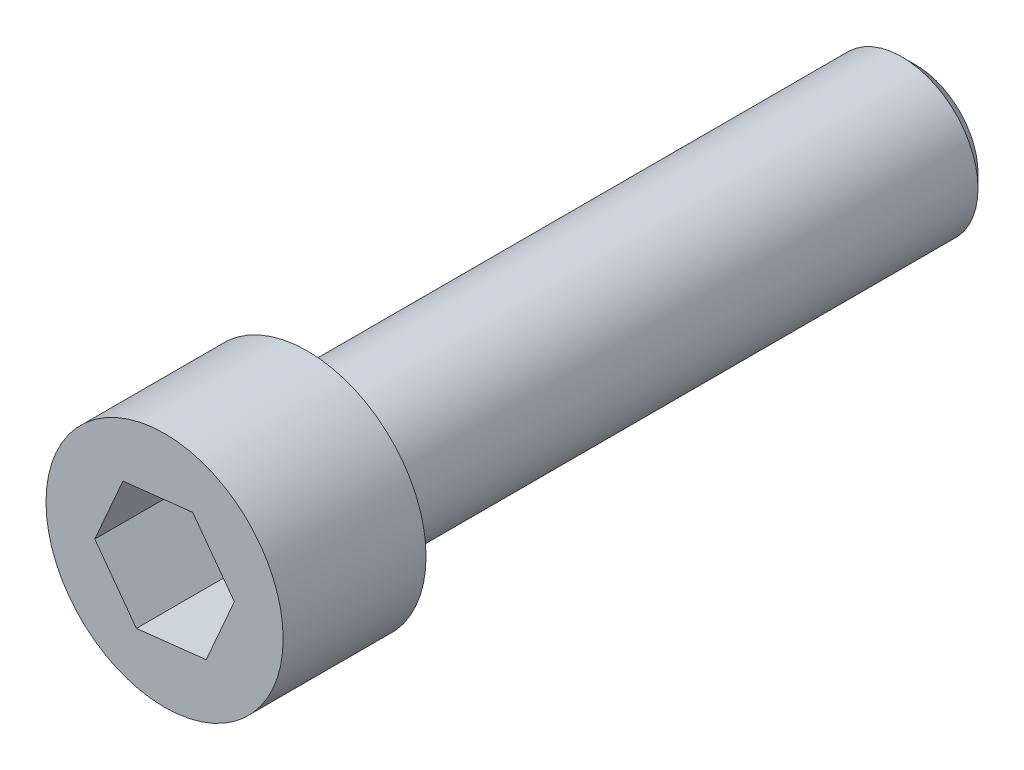
ISO-10303-21;
HEADER;
FILE_DESCRIPTION(('STEP AP214'),'2;1');
FILE_NAME('part.step','',(''),(''),'','','');
FILE_SCHEMA(('AUTOMOTIVE_DESIGN { 1 0 10303 214 1 1 1 1 }'));
ENDSEC;
DATA;
#1=APPLICATION_CONTEXT('core data for automotive mechanical design processes');
#2=APPLICATION_PROTOCOL_DEFINITION('international standard','automotive_design',2000,#1);
#3=PRODUCT_CONTEXT('',#1,'mechanical');
#4=PRODUCT('Part','Part','',(#3));
#5=PRODUCT_RELATED_PRODUCT_CATEGORY('part','',(#4));
#6=PRODUCT_DEFINITION_FORMATION('','',#4);
#7=PRODUCT_DEFINITION_CONTEXT('part definition',#1,'design');
#8=PRODUCT_DEFINITION('design','',#6,#7);
#9=PRODUCT_DEFINITION_SHAPE('','',#8);
#10=(LENGTH_UNIT() NAMED_UNIT(*) SI_UNIT(.MILLI.,.METRE.));
#11=(NAMED_UNIT(*) PLANE_ANGLE_UNIT() SI_UNIT($,.RADIAN.));
#12=(NAMED_UNIT(*) SI_UNIT($,.STERADIAN.) SOLID_ANGLE_UNIT());
#13=UNCERTAINTY_MEASURE_WITH_UNIT(LENGTH_MEASURE(1.E-05),#10,'distance_accuracy_value','');
#14=(GEOMETRIC_REPRESENTATION_CONTEXT(3) GLOBAL_UNCERTAINTY_ASSIGNED_CONTEXT((#13)) GLOBAL_UNIT_ASSIGNED_CONTEXT((#10,
#11,#12)) REPRESENTATION_CONTEXT('',''));
#15=CARTESIAN_POINT('',(0.,0.,0.));
#16=DIRECTION('',(0.,0.,1.));
#17=DIRECTION('',(1.,0.,0.));
#18=AXIS2_PLACEMENT_3D('',#15,#16,#17);
#19=CARTESIAN_POINT('',(0.,0.,4.7));
#20=DIRECTION('',(0.,0.,-1.));
#21=DIRECTION('',(-1.,0.,0.));
#22=AXIS2_PLACEMENT_3D('',#19,#20,#21);
#23=CYLINDRICAL_SURFACE('',#22,3.9);
#24=CARTESIAN_POINT('',(0.,0.,4.7));
#25=DIRECTION('',(0.,0.,1.));
#26=DIRECTION('',(1.,0.,0.));
#27=AXIS2_PLACEMENT_3D('',#24,#25,#26);
#28=CIRCLE('',#27,3.9);
#29=CARTESIAN_POINT('',(3.9,0.,4.7));
#30=VERTEX_POINT('',#29);
#31=EDGE_CURVE('E11',#30,#30,#28,.T.);
#32=ORIENTED_EDGE('',*,*,#31,.F.);
#33=EDGE_LOOP('',(#32));
#34=FACE_BOUND('',#33,.T.);
#35=CARTESIAN_POINT('',(0.,0.,0.));
#36=DIRECTION('',(0.,0.,1.));
#37=DIRECTION('',(1.,0.,0.));
#38=AXIS2_PLACEMENT_3D('',#35,#36,#37);
#39=CIRCLE('',#38,3.9);
#40=CARTESIAN_POINT('',(3.9,0.,0.));
#41=VERTEX_POINT('',#40);
#42=EDGE_CURVE('E52',#41,#41,#39,.T.);
#43=ORIENTED_EDGE('',*,*,#42,.T.);
#44=EDGE_LOOP('',(#43));
#45=FACE_BOUND('',#44,.T.);
#46=ADVANCED_FACE('F49',(#34,#45),#23,.T.);
#47=CARTESIAN_POINT('',(0.,0.,4.7));
#48=DIRECTION('',(0.,0.,1.));
#49=DIRECTION('',(1.,0.,0.));
#50=AXIS2_PLACEMENT_3D('',#47,#48,#49);
#51=PLANE('',#50);
#52=DIRECTION('',(0.993858891400407,0.110654886852563,0.));
#53=VECTOR('',#52,1.);
#54=CARTESIAN_POINT('',(-0.926299623267933,-2.11549104022377,4.7));
#55=LINE('',#54,#53);
#56=CARTESIAN_POINT('',(-0.926299623267933,-2.11549104022377,4.7));
#57=VERTEX_POINT('',#56);
#58=CARTESIAN_POINT('',(1.36891917067819,-1.85994452537787,4.7));
#59=VERTEX_POINT('',#58);
#60=EDGE_CURVE('E63',#57,#59,#55,.T.);
#61=ORIENTED_EDGE('',*,*,#60,.F.);
#62=DIRECTION('',(0.592759388767416,-0.805379604303511,0.));
#63=VECTOR('',#62,1.);
#64=CARTESIAN_POINT('',(-2.29521879394612,-0.255546514845901,4.7));
#65=LINE('',#64,#63);
#66=CARTESIAN_POINT('',(-2.29521879394612,-0.255546514845901,4.7));
#67=VERTEX_POINT('',#66);
#68=EDGE_CURVE('E146',#67,#57,#65,.T.);
#69=ORIENTED_EDGE('',*,*,#68,.F.);
#70=DIRECTION('',(-0.401099502632991,-0.916034491156074,0.));
#71=VECTOR('',#70,1.);
#72=CARTESIAN_POINT('',(-1.36891917067819,1.85994452537787,4.7));
#73=LINE('',#72,#71);
#74=CARTESIAN_POINT('',(-1.36891917067819,1.85994452537787,4.7));
#75=VERTEX_POINT('',#74);
#76=EDGE_CURVE('E144',#75,#67,#73,.T.);
#77=ORIENTED_EDGE('',*,*,#76,.F.);
#78=DIRECTION('',(-0.993858891400407,-0.110654886852563,0.));
#79=VECTOR('',#78,1.);
#80=CARTESIAN_POINT('',(0.926299623267934,2.11549104022377,4.7));
#81=LINE('',#80,#79);
#82=CARTESIAN_POINT('',(0.926299623267934,2.11549104022377,4.7));
#83=VERTEX_POINT('',#82);
#84=EDGE_CURVE('E111',#83,#75,#81,.T.);
#85=ORIENTED_EDGE('',*,*,#84,.F.);
#86=DIRECTION('',(-0.592759388767416,0.805379604303511,0.));
#87=VECTOR('',#86,1.);
#88=CARTESIAN_POINT('',(2.29521879394612,0.255546514845901,4.7));
#89=LINE('',#88,#87);
#90=CARTESIAN_POINT('',(2.29521879394612,0.255546514845901,4.7));
#91=VERTEX_POINT('',#90);
#92=EDGE_CURVE('E140',#91,#83,#89,.T.);
#93=ORIENTED_EDGE('',*,*,#92,.F.);
#94=DIRECTION('',(0.401099502632991,0.916034491156074,0.));
#95=VECTOR('',#94,1.);
#96=CARTESIAN_POINT('',(1.36891917067819,-1.85994452537787,4.7));
#97=LINE('',#96,#95);
#98=EDGE_CURVE('E137',#59,#91,#97,.T.);
#99=ORIENTED_EDGE('',*,*,#98,.F.);
#100=EDGE_LOOP('',(#61,#69,#77,#85,#93,#99));
#101=FACE_BOUND('',#100,.T.);
#102=ORIENTED_EDGE('',*,*,#31,.T.);
#103=EDGE_LOOP('',(#102));
#104=FACE_BOUND('',#103,.T.);
#105=ADVANCED_FACE('F172',(#101,#104),#51,.T.);
#106=CARTESIAN_POINT('',(0.,0.,0.));
#107=DIRECTION('',(0.,0.,1.));
#108=DIRECTION('',(1.,0.,0.));
#109=AXIS2_PLACEMENT_3D('',#106,#107,#108);
#110=PLANE('',#109);
#111=CARTESIAN_POINT('',(0.,0.,0.));
#112=DIRECTION('',(0.,0.,1.));
#113=DIRECTION('',(1.,0.,0.));
#114=AXIS2_PLACEMENT_3D('',#111,#112,#113);
#115=CIRCLE('',#114,2.5);
#116=CARTESIAN_POINT('',(2.5,0.,0.));
#117=VERTEX_POINT('',#116);
#118=EDGE_CURVE('E150',#117,#117,#115,.T.);
#119=ORIENTED_EDGE('',*,*,#118,.T.);
#120=EDGE_LOOP('',(#119));
#121=FACE_BOUND('',#120,.T.);
#122=ORIENTED_EDGE('',*,*,#42,.F.);
#123=EDGE_LOOP('',(#122));
#124=FACE_BOUND('',#123,.T.);
#125=ADVANCED_FACE('F169',(#121,#124),#110,.F.);
#126=CARTESIAN_POINT('',(2.055,0.,-20.));
#127=DIRECTION('',(0.,0.,-1.));
#128=DIRECTION('',(-1.,0.,0.));
#129=AXIS2_PLACEMENT_3D('',#126,#127,#128);
#130=PLANE('',#129);
#131=CARTESIAN_POINT('',(0.,0.,-20.));
#132=DIRECTION('',(0.,0.,1.));
#133=DIRECTION('',(1.,0.,0.));
#134=AXIS2_PLACEMENT_3D('',#131,#132,#133);
#135=CIRCLE('',#134,2.055);
#136=CARTESIAN_POINT('',(2.055,0.,-20.));
#137=VERTEX_POINT('',#136);
#138=EDGE_CURVE('E161',#137,#137,#135,.T.);
#139=ORIENTED_EDGE('',*,*,#138,.F.);
#140=EDGE_LOOP('',(#139));
#141=FACE_BOUND('',#140,.T.);
#142=ADVANCED_FACE('F171',(#141),#130,.T.);
#143=CARTESIAN_POINT('',(0.,0.,-19.555));
#144=DIRECTION('',(0.,0.,1.));
#145=DIRECTION('',(1.,0.,0.));
#146=AXIS2_PLACEMENT_3D('',#143,#144,#145);
#147=CONICAL_SURFACE('',#146,2.5,0.785398163397452);
#148=ORIENTED_EDGE('',*,*,#138,.T.);
#149=EDGE_LOOP('',(#148));
#150=FACE_BOUND('',#149,.T.);
#151=CARTESIAN_POINT('',(0.,0.,-19.555));
#152=DIRECTION('',(0.,0.,1.));
#153=DIRECTION('',(1.,0.,0.));
#154=AXIS2_PLACEMENT_3D('',#151,#152,#153);
#155=CIRCLE('',#154,2.5);
#156=CARTESIAN_POINT('',(2.5,0.,-19.555));
#157=VERTEX_POINT('',#156);
#158=EDGE_CURVE('E158',#157,#157,#155,.T.);
#159=ORIENTED_EDGE('',*,*,#158,.F.);
#160=EDGE_LOOP('',(#159));
#161=FACE_BOUND('',#160,.T.);
#162=ADVANCED_FACE('F179',(#150,#161),#147,.T.);
#163=CARTESIAN_POINT('',(0.,0.,0.));
#164=DIRECTION('',(0.,0.,1.));
#165=DIRECTION('',(1.,0.,0.));
#166=AXIS2_PLACEMENT_3D('',#163,#164,#165);
#167=CYLINDRICAL_SURFACE('',#166,2.5);
#168=ORIENTED_EDGE('',*,*,#158,.T.);
#169=EDGE_LOOP('',(#168));
#170=FACE_BOUND('',#169,.T.);
#171=ORIENTED_EDGE('',*,*,#118,.F.);
#172=EDGE_LOOP('',(#171));
#173=FACE_BOUND('',#172,.T.);
#174=ADVANCED_FACE('F210',(#170,#173),#167,.T.);
#175=CARTESIAN_POINT('',(-0.926299623267933,-2.11549104022377,1.5));
#176=DIRECTION('',(0.110654886852563,-0.993858891400407,0.));
#177=DIRECTION('',(0.993858891400407,0.110654886852563,0.));
#178=AXIS2_PLACEMENT_3D('',#175,#176,#177);
#179=PLANE('',#178);
#180=ORIENTED_EDGE('',*,*,#60,.T.);
#181=DIRECTION('',(0.,0.,1.));
#182=VECTOR('',#181,1.);
#183=CARTESIAN_POINT('',(1.36891917067819,-1.85994452537787,1.5));
#184=LINE('',#183,#182);
#185=CARTESIAN_POINT('',(1.36891917067819,-1.85994452537787,1.5));
#186=VERTEX_POINT('',#185);
#187=EDGE_CURVE('E93',#186,#59,#184,.T.);
#188=ORIENTED_EDGE('',*,*,#187,.F.);
#189=DIRECTION('',(0.993858891400407,0.110654886852563,0.));
#190=VECTOR('',#189,1.);
#191=CARTESIAN_POINT('',(-0.926299623267933,-2.11549104022377,1.5));
#192=LINE('',#191,#190);
#193=CARTESIAN_POINT('',(-0.926299623267933,-2.11549104022377,1.5));
#194=VERTEX_POINT('',#193);
#195=EDGE_CURVE('E148',#194,#186,#192,.T.);
#196=ORIENTED_EDGE('',*,*,#195,.F.);
#197=DIRECTION('',(0.,0.,1.));
#198=VECTOR('',#197,1.);
#199=CARTESIAN_POINT('',(-0.926299623267933,-2.11549104022377,1.5));
#200=LINE('',#199,#198);
#201=EDGE_CURVE('E71',#194,#57,#200,.T.);
#202=ORIENTED_EDGE('',*,*,#201,.T.);
#203=EDGE_LOOP('',(#180,#188,#196,#202));
#204=FACE_BOUND('',#203,.T.);
#205=ADVANCED_FACE('F217',(#204),#179,.F.);
#206=CARTESIAN_POINT('',(-2.29521879394612,-0.255546514845901,1.5));
#207=DIRECTION('',(-0.805379604303511,-0.592759388767416,0.));
#208=DIRECTION('',(0.592759388767416,-0.805379604303511,0.));
#209=AXIS2_PLACEMENT_3D('',#206,#207,#208);
#210=PLANE('',#209);
#211=ORIENTED_EDGE('',*,*,#68,.T.);
#212=ORIENTED_EDGE('',*,*,#201,.F.);
#213=DIRECTION('',(0.592759388767416,-0.805379604303511,0.));
#214=VECTOR('',#213,1.);
#215=CARTESIAN_POINT('',(-2.29521879394612,-0.255546514845901,1.5));
#216=LINE('',#215,#214);
#217=CARTESIAN_POINT('',(-2.29521879394612,-0.255546514845901,1.5));
#218=VERTEX_POINT('',#217);
#219=EDGE_CURVE('E123',#218,#194,#216,.T.);
#220=ORIENTED_EDGE('',*,*,#219,.F.);
#221=DIRECTION('',(0.,0.,1.));
#222=VECTOR('',#221,1.);
#223=CARTESIAN_POINT('',(-2.29521879394612,-0.255546514845901,1.5));
#224=LINE('',#223,#222);
#225=EDGE_CURVE('E115',#218,#67,#224,.T.);
#226=ORIENTED_EDGE('',*,*,#225,.T.);
#227=EDGE_LOOP('',(#211,#212,#220,#226));
#228=FACE_BOUND('',#227,.T.);
#229=ADVANCED_FACE('F225',(#228),#210,.F.);
#230=CARTESIAN_POINT('',(-1.36891917067819,1.85994452537787,1.5));
#231=DIRECTION('',(-0.916034491156074,0.401099502632991,0.));
#232=DIRECTION('',(-0.401099502632991,-0.916034491156074,0.));
#233=AXIS2_PLACEMENT_3D('',#230,#231,#232);
#234=PLANE('',#233);
#235=ORIENTED_EDGE('',*,*,#76,.T.);
#236=ORIENTED_EDGE('',*,*,#225,.F.);
#237=DIRECTION('',(-0.401099502632991,-0.916034491156074,0.));
#238=VECTOR('',#237,1.);
#239=CARTESIAN_POINT('',(-1.36891917067819,1.85994452537787,1.5));
#240=LINE('',#239,#238);
#241=CARTESIAN_POINT('',(-1.36891917067819,1.85994452537787,1.5));
#242=VERTEX_POINT('',#241);
#243=EDGE_CURVE('E119',#242,#218,#240,.T.);
#244=ORIENTED_EDGE('',*,*,#243,.F.);
#245=DIRECTION('',(0.,0.,1.));
#246=VECTOR('',#245,1.);
#247=CARTESIAN_POINT('',(-1.36891917067819,1.85994452537787,1.5));
#248=LINE('',#247,#246);
#249=EDGE_CURVE('E104',#242,#75,#248,.T.);
#250=ORIENTED_EDGE('',*,*,#249,.T.);
#251=EDGE_LOOP('',(#235,#236,#244,#250));
#252=FACE_BOUND('',#251,.T.);
#253=ADVANCED_FACE('F120',(#252),#234,.F.);
#254=CARTESIAN_POINT('',(0.926299623267934,2.11549104022377,1.5));
#255=DIRECTION('',(-0.110654886852563,0.993858891400407,0.));
#256=DIRECTION('',(-0.993858891400407,-0.110654886852563,0.));
#257=AXIS2_PLACEMENT_3D('',#254,#255,#256);
#258=PLANE('',#257);
#259=ORIENTED_EDGE('',*,*,#84,.T.);
#260=ORIENTED_EDGE('',*,*,#249,.F.);
#261=DIRECTION('',(-0.993858891400407,-0.110654886852563,0.));
#262=VECTOR('',#261,1.);
#263=CARTESIAN_POINT('',(0.926299623267934,2.11549104022377,1.5));
#264=LINE('',#263,#262);
#265=CARTESIAN_POINT('',(0.926299623267934,2.11549104022377,1.5));
#266=VERTEX_POINT('',#265);
#267=EDGE_CURVE('E108',#266,#242,#264,.T.);
#268=ORIENTED_EDGE('',*,*,#267,.F.);
#269=DIRECTION('',(0.,0.,1.));
#270=VECTOR('',#269,1.);
#271=CARTESIAN_POINT('',(0.926299623267934,2.11549104022377,1.5));
#272=LINE('',#271,#270);
#273=EDGE_CURVE('E116',#266,#83,#272,.T.);
#274=ORIENTED_EDGE('',*,*,#273,.T.);
#275=EDGE_LOOP('',(#259,#260,#268,#274));
#276=FACE_BOUND('',#275,.T.);
#277=ADVANCED_FACE('F106',(#276),#258,.F.);
#278=CARTESIAN_POINT('',(2.29521879394612,0.255546514845901,1.5));
#279=DIRECTION('',(0.805379604303511,0.592759388767416,0.));
#280=DIRECTION('',(-0.592759388767416,0.805379604303511,0.));
#281=AXIS2_PLACEMENT_3D('',#278,#279,#280);
#282=PLANE('',#281);
#283=ORIENTED_EDGE('',*,*,#92,.T.);
#284=ORIENTED_EDGE('',*,*,#273,.F.);
#285=DIRECTION('',(-0.592759388767416,0.805379604303511,0.));
#286=VECTOR('',#285,1.);
#287=CARTESIAN_POINT('',(2.29521879394612,0.255546514845901,1.5));
#288=LINE('',#287,#286);
#289=CARTESIAN_POINT('',(2.29521879394612,0.255546514845901,1.5));
#290=VERTEX_POINT('',#289);
#291=EDGE_CURVE('E129',#290,#266,#288,.T.);
#292=ORIENTED_EDGE('',*,*,#291,.F.);
#293=DIRECTION('',(0.,0.,1.));
#294=VECTOR('',#293,1.);
#295=CARTESIAN_POINT('',(2.29521879394612,0.255546514845901,1.5));
#296=LINE('',#295,#294);
#297=EDGE_CURVE('E153',#290,#91,#296,.T.);
#298=ORIENTED_EDGE('',*,*,#297,.T.);
#299=EDGE_LOOP('',(#283,#284,#292,#298));
#300=FACE_BOUND('',#299,.T.);
#301=ADVANCED_FACE('F244',(#300),#282,.F.);
#302=CARTESIAN_POINT('',(1.36891917067819,-1.85994452537787,1.5));
#303=DIRECTION('',(0.916034491156074,-0.401099502632991,0.));
#304=DIRECTION('',(0.401099502632991,0.916034491156074,0.));
#305=AXIS2_PLACEMENT_3D('',#302,#303,#304);
#306=PLANE('',#305);
#307=ORIENTED_EDGE('',*,*,#98,.T.);
#308=ORIENTED_EDGE('',*,*,#297,.F.);
#309=DIRECTION('',(0.401099502632991,0.916034491156074,0.));
#310=VECTOR('',#309,1.);
#311=CARTESIAN_POINT('',(1.36891917067819,-1.85994452537787,1.5));
#312=LINE('',#311,#310);
#313=EDGE_CURVE('E131',#186,#290,#312,.T.);
#314=ORIENTED_EDGE('',*,*,#313,.F.);
#315=ORIENTED_EDGE('',*,*,#187,.T.);
#316=EDGE_LOOP('',(#307,#308,#314,#315));
#317=FACE_BOUND('',#316,.T.);
#318=ADVANCED_FACE('F251',(#317),#306,.F.);
#319=CARTESIAN_POINT('',(0.,0.,1.5));
#320=DIRECTION('',(0.,0.,1.));
#321=DIRECTION('',(1.,0.,0.));
#322=AXIS2_PLACEMENT_3D('',#319,#320,#321);
#323=PLANE('',#322);
#324=ORIENTED_EDGE('',*,*,#195,.T.);
#325=ORIENTED_EDGE('',*,*,#313,.T.);
#326=ORIENTED_EDGE('',*,*,#291,.T.);
#327=ORIENTED_EDGE('',*,*,#267,.T.);
#328=ORIENTED_EDGE('',*,*,#243,.T.);
#329=ORIENTED_EDGE('',*,*,#219,.T.);
#330=EDGE_LOOP('',(#324,#325,#326,#327,#328,#329));
#331=FACE_BOUND('',#330,.T.);
#332=ADVANCED_FACE('F126',(#331),#323,.T.);
#333=CLOSED_SHELL('',(#46,#105,#125,#142,#162,#174,#205,#229,#253,#277,#301,#318,#332));
#334=MANIFOLD_SOLID_BREP('B2',#333);
#335=ADVANCED_BREP_SHAPE_REPRESENTATION('',(#18,#334),#14);
#336=SHAPE_DEFINITION_REPRESENTATION(#9,#335);
ENDSEC;
END-ISO-10303-21;
